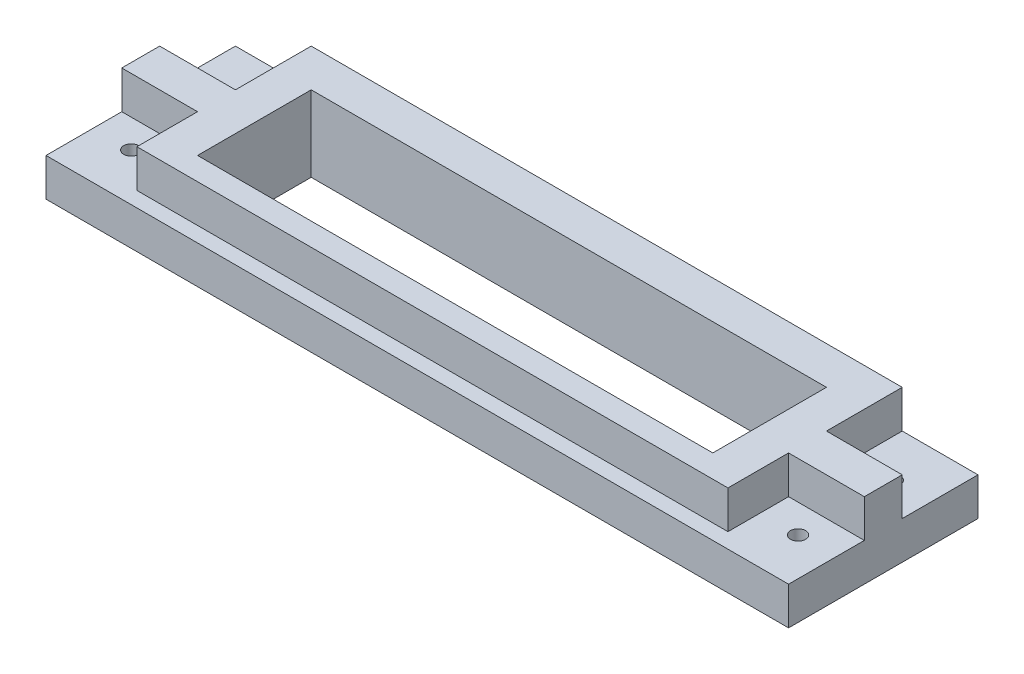
ISO-10303-21;
HEADER;
FILE_DESCRIPTION(('STEP AP214'),'2;1');
FILE_NAME('part.step','',(''),(''),'','','');
FILE_SCHEMA(('AUTOMOTIVE_DESIGN { 1 0 10303 214 1 1 1 1 }'));
ENDSEC;
DATA;
#1=APPLICATION_CONTEXT('core data for automotive mechanical design processes');
#2=APPLICATION_PROTOCOL_DEFINITION('international standard','automotive_design',2000,#1);
#3=PRODUCT_CONTEXT('',#1,'mechanical');
#4=PRODUCT('Part','Part','',(#3));
#5=PRODUCT_RELATED_PRODUCT_CATEGORY('part','',(#4));
#6=PRODUCT_DEFINITION_FORMATION('','',#4);
#7=PRODUCT_DEFINITION_CONTEXT('part definition',#1,'design');
#8=PRODUCT_DEFINITION('design','',#6,#7);
#9=PRODUCT_DEFINITION_SHAPE('','',#8);
#10=(LENGTH_UNIT() NAMED_UNIT(*) SI_UNIT(.MILLI.,.METRE.));
#11=(NAMED_UNIT(*) PLANE_ANGLE_UNIT() SI_UNIT($,.RADIAN.));
#12=(NAMED_UNIT(*) SI_UNIT($,.STERADIAN.) SOLID_ANGLE_UNIT());
#13=UNCERTAINTY_MEASURE_WITH_UNIT(LENGTH_MEASURE(1.E-05),#10,'distance_accuracy_value','');
#14=(GEOMETRIC_REPRESENTATION_CONTEXT(3) GLOBAL_UNCERTAINTY_ASSIGNED_CONTEXT((#13)) GLOBAL_UNIT_ASSIGNED_CONTEXT((#10,
#11,#12)) REPRESENTATION_CONTEXT('',''));
#15=CARTESIAN_POINT('',(0.,0.,0.));
#16=DIRECTION('',(0.,0.,1.));
#17=DIRECTION('',(1.,0.,0.));
#18=AXIS2_PLACEMENT_3D('',#15,#16,#17);
#19=CARTESIAN_POINT('',(0.,0.,0.));
#20=DIRECTION('',(0.,1.,0.));
#21=DIRECTION('',(0.,0.,1.));
#22=AXIS2_PLACEMENT_3D('',#19,#20,#21);
#23=PLANE('',#22);
#24=CARTESIAN_POINT('',(44.,0.,-6.25));
#25=DIRECTION('',(0.,-1.,0.));
#26=DIRECTION('',(0.,0.,-1.));
#27=AXIS2_PLACEMENT_3D('',#24,#25,#26);
#28=CIRCLE('',#27,1.75);
#29=CARTESIAN_POINT('',(44.,0.,-8.00000000000001));
#30=VERTEX_POINT('',#29);
#31=EDGE_CURVE('E252',#30,#30,#28,.T.);
#32=ORIENTED_EDGE('',*,*,#31,.F.);
#33=EDGE_LOOP('',(#32));
#34=FACE_BOUND('',#33,.T.);
#35=CARTESIAN_POINT('',(-44.,0.,6.25));
#36=DIRECTION('',(0.,-1.,0.));
#37=DIRECTION('',(0.,0.,-1.));
#38=AXIS2_PLACEMENT_3D('',#35,#36,#37);
#39=CIRCLE('',#38,1.75);
#40=CARTESIAN_POINT('',(-44.,0.,4.5));
#41=VERTEX_POINT('',#40);
#42=EDGE_CURVE('E271',#41,#41,#39,.T.);
#43=ORIENTED_EDGE('',*,*,#42,.F.);
#44=EDGE_LOOP('',(#43));
#45=FACE_BOUND('',#44,.T.);
#46=DIRECTION('',(-1.,0.,0.));
#47=VECTOR('',#46,1.);
#48=CARTESIAN_POINT('',(-39.,0.,-12.5));
#49=LINE('',#48,#47);
#50=CARTESIAN_POINT('',(49.,0.,-12.5));
#51=VERTEX_POINT('',#50);
#52=CARTESIAN_POINT('',(-49.,0.,-12.5));
#53=VERTEX_POINT('',#52);
#54=EDGE_CURVE('E228',#51,#53,#49,.T.);
#55=ORIENTED_EDGE('',*,*,#54,.F.);
#56=DIRECTION('',(0.,0.,-1.));
#57=VECTOR('',#56,1.);
#58=CARTESIAN_POINT('',(49.,0.,12.5));
#59=LINE('',#58,#57);
#60=CARTESIAN_POINT('',(49.,0.,12.5));
#61=VERTEX_POINT('',#60);
#62=EDGE_CURVE('E350',#61,#51,#59,.T.);
#63=ORIENTED_EDGE('',*,*,#62,.F.);
#64=DIRECTION('',(1.,0.,0.));
#65=VECTOR('',#64,1.);
#66=CARTESIAN_POINT('',(-39.,0.,12.5));
#67=LINE('',#66,#65);
#68=CARTESIAN_POINT('',(-49.,0.,12.5));
#69=VERTEX_POINT('',#68);
#70=EDGE_CURVE('E219',#69,#61,#67,.T.);
#71=ORIENTED_EDGE('',*,*,#70,.F.);
#72=DIRECTION('',(0.,0.,1.));
#73=VECTOR('',#72,1.);
#74=CARTESIAN_POINT('',(-49.,0.,12.5));
#75=LINE('',#74,#73);
#76=EDGE_CURVE('E371',#53,#69,#75,.T.);
#77=ORIENTED_EDGE('',*,*,#76,.F.);
#78=EDGE_LOOP('',(#55,#63,#71,#77));
#79=FACE_BOUND('',#78,.T.);
#80=DIRECTION('',(0.,0.,-1.));
#81=VECTOR('',#80,1.);
#82=CARTESIAN_POINT('',(-34.,0.,0.));
#83=LINE('',#82,#81);
#84=CARTESIAN_POINT('',(-34.,0.,7.50000000000001));
#85=VERTEX_POINT('',#84);
#86=CARTESIAN_POINT('',(-34.,0.,-7.50000000000001));
#87=VERTEX_POINT('',#86);
#88=EDGE_CURVE('E398',#85,#87,#83,.T.);
#89=ORIENTED_EDGE('',*,*,#88,.F.);
#90=DIRECTION('',(-1.,0.,0.));
#91=VECTOR('',#90,1.);
#92=CARTESIAN_POINT('',(0.,0.,7.50000000000001));
#93=LINE('',#92,#91);
#94=CARTESIAN_POINT('',(34.,0.,7.50000000000001));
#95=VERTEX_POINT('',#94);
#96=EDGE_CURVE('E401',#95,#85,#93,.T.);
#97=ORIENTED_EDGE('',*,*,#96,.F.);
#98=DIRECTION('',(0.,0.,-1.));
#99=VECTOR('',#98,1.);
#100=CARTESIAN_POINT('',(34.,0.,0.));
#101=LINE('',#100,#99);
#102=CARTESIAN_POINT('',(34.,0.,-7.50000000000001));
#103=VERTEX_POINT('',#102);
#104=EDGE_CURVE('E405',#95,#103,#101,.T.);
#105=ORIENTED_EDGE('',*,*,#104,.T.);
#106=DIRECTION('',(-1.,0.,0.));
#107=VECTOR('',#106,1.);
#108=CARTESIAN_POINT('',(0.,0.,-7.50000000000001));
#109=LINE('',#108,#107);
#110=EDGE_CURVE('E409',#103,#87,#109,.T.);
#111=ORIENTED_EDGE('',*,*,#110,.T.);
#112=EDGE_LOOP('',(#89,#97,#105,#111));
#113=FACE_BOUND('',#112,.T.);
#114=CARTESIAN_POINT('',(44.,0.,6.25));
#115=DIRECTION('',(0.,-1.,0.));
#116=DIRECTION('',(0.,0.,-1.));
#117=AXIS2_PLACEMENT_3D('',#114,#115,#116);
#118=CIRCLE('',#117,1.75);
#119=CARTESIAN_POINT('',(44.,0.,4.5));
#120=VERTEX_POINT('',#119);
#121=EDGE_CURVE('E263',#120,#120,#118,.F.);
#122=ORIENTED_EDGE('',*,*,#121,.T.);
#123=EDGE_LOOP('',(#122));
#124=FACE_BOUND('',#123,.T.);
#125=CARTESIAN_POINT('',(-44.,0.,-6.25));
#126=DIRECTION('',(0.,-1.,0.));
#127=DIRECTION('',(0.,0.,-1.));
#128=AXIS2_PLACEMENT_3D('',#125,#126,#127);
#129=CIRCLE('',#128,1.75);
#130=CARTESIAN_POINT('',(-44.,0.,-8.00000000000001));
#131=VERTEX_POINT('',#130);
#132=EDGE_CURVE('E272',#131,#131,#129,.F.);
#133=ORIENTED_EDGE('',*,*,#132,.T.);
#134=EDGE_LOOP('',(#133));
#135=FACE_BOUND('',#134,.T.);
#136=ADVANCED_FACE('F46',(#34,#45,#79,#113,#124,#135),#23,.F.);
#137=CARTESIAN_POINT('',(-39.,10.,-12.5));
#138=DIRECTION('',(1.,0.,0.));
#139=DIRECTION('',(0.,0.,-1.));
#140=AXIS2_PLACEMENT_3D('',#137,#138,#139);
#141=PLANE('',#140);
#142=DIRECTION('',(0.,0.,-1.));
#143=VECTOR('',#142,1.);
#144=CARTESIAN_POINT('',(-39.,5.,-12.5));
#145=LINE('',#144,#143);
#146=CARTESIAN_POINT('',(-39.,5.,10.5));
#147=VERTEX_POINT('',#146);
#148=CARTESIAN_POINT('',(-39.,5.,2.5));
#149=VERTEX_POINT('',#148);
#150=EDGE_CURVE('E376',#147,#149,#145,.T.);
#151=ORIENTED_EDGE('',*,*,#150,.F.);
#152=DIRECTION('',(0.,-1.,0.));
#153=VECTOR('',#152,1.);
#154=CARTESIAN_POINT('',(-39.,10.,10.5));
#155=LINE('',#154,#153);
#156=CARTESIAN_POINT('',(-39.,10.,10.5));
#157=VERTEX_POINT('',#156);
#158=EDGE_CURVE('E208',#157,#147,#155,.T.);
#159=ORIENTED_EDGE('',*,*,#158,.F.);
#160=DIRECTION('',(0.,0.,1.));
#161=VECTOR('',#160,1.);
#162=CARTESIAN_POINT('',(-39.,10.,-12.5));
#163=LINE('',#162,#161);
#164=CARTESIAN_POINT('',(-39.,10.,2.5));
#165=VERTEX_POINT('',#164);
#166=EDGE_CURVE('E206',#165,#157,#163,.T.);
#167=ORIENTED_EDGE('',*,*,#166,.F.);
#168=DIRECTION('',(0.,-1.,0.));
#169=VECTOR('',#168,1.);
#170=CARTESIAN_POINT('',(-39.,10.,2.5));
#171=LINE('',#170,#169);
#172=EDGE_CURVE('E314',#165,#149,#171,.T.);
#173=ORIENTED_EDGE('',*,*,#172,.T.);
#174=EDGE_LOOP('',(#151,#159,#167,#173));
#175=FACE_BOUND('',#174,.T.);
#176=ADVANCED_FACE('F468',(#175),#141,.F.);
#177=CARTESIAN_POINT('',(39.,10.,-12.5));
#178=DIRECTION('',(-1.,0.,0.));
#179=DIRECTION('',(0.,0.,1.));
#180=AXIS2_PLACEMENT_3D('',#177,#178,#179);
#181=PLANE('',#180);
#182=DIRECTION('',(0.,-1.,0.));
#183=VECTOR('',#182,1.);
#184=CARTESIAN_POINT('',(39.,10.,-2.50000000000003));
#185=LINE('',#184,#183);
#186=CARTESIAN_POINT('',(39.,10.,-2.50000000000003));
#187=VERTEX_POINT('',#186);
#188=CARTESIAN_POINT('',(39.,5.,-2.50000000000003));
#189=VERTEX_POINT('',#188);
#190=EDGE_CURVE('E338',#187,#189,#185,.T.);
#191=ORIENTED_EDGE('',*,*,#190,.T.);
#192=DIRECTION('',(0.,0.,1.));
#193=VECTOR('',#192,1.);
#194=CARTESIAN_POINT('',(39.,5.,12.5));
#195=LINE('',#194,#193);
#196=CARTESIAN_POINT('',(39.,5.,-12.5));
#197=VERTEX_POINT('',#196);
#198=EDGE_CURVE('E351',#197,#189,#195,.T.);
#199=ORIENTED_EDGE('',*,*,#198,.F.);
#200=DIRECTION('',(0.,-1.,0.));
#201=VECTOR('',#200,1.);
#202=CARTESIAN_POINT('',(39.,10.,-12.5));
#203=LINE('',#202,#201);
#204=CARTESIAN_POINT('',(39.,10.,-12.5));
#205=VERTEX_POINT('',#204);
#206=EDGE_CURVE('E11',#205,#197,#203,.T.);
#207=ORIENTED_EDGE('',*,*,#206,.F.);
#208=DIRECTION('',(0.,0.,-1.));
#209=VECTOR('',#208,1.);
#210=CARTESIAN_POINT('',(39.,10.,-12.5));
#211=LINE('',#210,#209);
#212=EDGE_CURVE('E214',#187,#205,#211,.T.);
#213=ORIENTED_EDGE('',*,*,#212,.F.);
#214=EDGE_LOOP('',(#191,#199,#207,#213));
#215=FACE_BOUND('',#214,.T.);
#216=ADVANCED_FACE('F474',(#215),#181,.F.);
#217=CARTESIAN_POINT('',(49.,5.,12.5));
#218=DIRECTION('',(0.,-1.,0.));
#219=DIRECTION('',(0.,0.,-1.));
#220=AXIS2_PLACEMENT_3D('',#217,#218,#219);
#221=PLANE('',#220);
#222=CARTESIAN_POINT('',(44.,5.,-6.24999999999999));
#223=DIRECTION('',(0.,-1.,0.));
#224=DIRECTION('',(0.,0.,-1.));
#225=AXIS2_PLACEMENT_3D('',#222,#223,#224);
#226=CIRCLE('',#225,0.999999999999998);
#227=CARTESIAN_POINT('',(44.,5.,-7.24999999999999));
#228=VERTEX_POINT('',#227);
#229=EDGE_CURVE('E245',#228,#228,#226,.T.);
#230=ORIENTED_EDGE('',*,*,#229,.T.);
#231=EDGE_LOOP('',(#230));
#232=FACE_BOUND('',#231,.T.);
#233=DIRECTION('',(-1.,0.,0.));
#234=VECTOR('',#233,1.);
#235=CARTESIAN_POINT('',(0.,5.,-2.49999999999994));
#236=LINE('',#235,#234);
#237=CARTESIAN_POINT('',(49.,5.,-2.50000000000005));
#238=VERTEX_POINT('',#237);
#239=EDGE_CURVE('E318',#238,#189,#236,.T.);
#240=ORIENTED_EDGE('',*,*,#239,.F.);
#241=DIRECTION('',(0.,0.,1.));
#242=VECTOR('',#241,1.);
#243=CARTESIAN_POINT('',(49.,5.,12.5));
#244=LINE('',#243,#242);
#245=CARTESIAN_POINT('',(49.,5.,-12.5));
#246=VERTEX_POINT('',#245);
#247=EDGE_CURVE('E359',#246,#238,#244,.T.);
#248=ORIENTED_EDGE('',*,*,#247,.F.);
#249=DIRECTION('',(-1.,0.,0.));
#250=VECTOR('',#249,1.);
#251=CARTESIAN_POINT('',(49.,5.,-12.5));
#252=LINE('',#251,#250);
#253=EDGE_CURVE('E363',#246,#197,#252,.T.);
#254=ORIENTED_EDGE('',*,*,#253,.T.);
#255=ORIENTED_EDGE('',*,*,#198,.T.);
#256=EDGE_LOOP('',(#240,#248,#254,#255));
#257=FACE_BOUND('',#256,.T.);
#258=ADVANCED_FACE('F571',(#232,#257),#221,.F.);
#259=CARTESIAN_POINT('',(39.,10.,10.5));
#260=VERTEX_POINT('',#259);
#261=CARTESIAN_POINT('',(39.,10.,2.5));
#262=VERTEX_POINT('',#261);
#263=EDGE_CURVE('E203',#260,#262,#211,.T.);
#264=ORIENTED_EDGE('',*,*,#263,.F.);
#265=DIRECTION('',(0.,1.,0.));
#266=VECTOR('',#265,1.);
#267=CARTESIAN_POINT('',(39.,10.,10.5));
#268=LINE('',#267,#266);
#269=CARTESIAN_POINT('',(39.,5.,10.5));
#270=VERTEX_POINT('',#269);
#271=EDGE_CURVE('E185',#270,#260,#268,.T.);
#272=ORIENTED_EDGE('',*,*,#271,.F.);
#273=CARTESIAN_POINT('',(39.,5.,2.5));
#274=VERTEX_POINT('',#273);
#275=EDGE_CURVE('E345',#274,#270,#195,.T.);
#276=ORIENTED_EDGE('',*,*,#275,.F.);
#277=DIRECTION('',(0.,-1.,0.));
#278=VECTOR('',#277,1.);
#279=CARTESIAN_POINT('',(39.,10.,2.5));
#280=LINE('',#279,#278);
#281=EDGE_CURVE('E211',#262,#274,#280,.T.);
#282=ORIENTED_EDGE('',*,*,#281,.F.);
#283=EDGE_LOOP('',(#264,#272,#276,#282));
#284=FACE_BOUND('',#283,.T.);
#285=ADVANCED_FACE('F48',(#284),#181,.F.);
#286=CARTESIAN_POINT('',(-39.,5.,-2.50000000000003));
#287=VERTEX_POINT('',#286);
#288=CARTESIAN_POINT('',(-39.,5.,-12.5));
#289=VERTEX_POINT('',#288);
#290=EDGE_CURVE('E370',#287,#289,#145,.T.);
#291=ORIENTED_EDGE('',*,*,#290,.F.);
#292=DIRECTION('',(0.,-1.,0.));
#293=VECTOR('',#292,1.);
#294=CARTESIAN_POINT('',(-39.,10.,-2.50000000000003));
#295=LINE('',#294,#293);
#296=CARTESIAN_POINT('',(-39.,10.,-2.50000000000003));
#297=VERTEX_POINT('',#296);
#298=EDGE_CURVE('E311',#297,#287,#295,.T.);
#299=ORIENTED_EDGE('',*,*,#298,.F.);
#300=CARTESIAN_POINT('',(-39.,10.,-12.5));
#301=VERTEX_POINT('',#300);
#302=EDGE_CURVE('E224',#301,#297,#163,.T.);
#303=ORIENTED_EDGE('',*,*,#302,.F.);
#304=DIRECTION('',(0.,-1.,0.));
#305=VECTOR('',#304,1.);
#306=CARTESIAN_POINT('',(-39.,10.,-12.5));
#307=LINE('',#306,#305);
#308=EDGE_CURVE('E56',#301,#289,#307,.T.);
#309=ORIENTED_EDGE('',*,*,#308,.T.);
#310=EDGE_LOOP('',(#291,#299,#303,#309));
#311=FACE_BOUND('',#310,.T.);
#312=ADVANCED_FACE('F477',(#311),#141,.F.);
#313=CARTESIAN_POINT('',(0.,10.,0.));
#314=DIRECTION('',(0.,1.,0.));
#315=DIRECTION('',(0.,0.,1.));
#316=AXIS2_PLACEMENT_3D('',#313,#314,#315);
#317=PLANE('',#316);
#318=DIRECTION('',(-1.,0.,0.));
#319=VECTOR('',#318,1.);
#320=CARTESIAN_POINT('',(39.,10.,10.5));
#321=LINE('',#320,#319);
#322=EDGE_CURVE('E188',#260,#157,#321,.T.);
#323=ORIENTED_EDGE('',*,*,#322,.F.);
#324=ORIENTED_EDGE('',*,*,#263,.T.);
#325=DIRECTION('',(-1.,0.,0.));
#326=VECTOR('',#325,1.);
#327=CARTESIAN_POINT('',(0.,10.,2.49999999999999));
#328=LINE('',#327,#326);
#329=CARTESIAN_POINT('',(49.,10.,2.5));
#330=VERTEX_POINT('',#329);
#331=EDGE_CURVE('E326',#330,#262,#328,.T.);
#332=ORIENTED_EDGE('',*,*,#331,.F.);
#333=DIRECTION('',(0.,0.,1.));
#334=VECTOR('',#333,1.);
#335=CARTESIAN_POINT('',(49.,10.,0.));
#336=LINE('',#335,#334);
#337=CARTESIAN_POINT('',(49.,10.,-2.50000000000005));
#338=VERTEX_POINT('',#337);
#339=EDGE_CURVE('E319',#338,#330,#336,.T.);
#340=ORIENTED_EDGE('',*,*,#339,.F.);
#341=DIRECTION('',(-1.,0.,0.));
#342=VECTOR('',#341,1.);
#343=CARTESIAN_POINT('',(0.,10.,-2.49999999999994));
#344=LINE('',#343,#342);
#345=EDGE_CURVE('E323',#338,#187,#344,.T.);
#346=ORIENTED_EDGE('',*,*,#345,.T.);
#347=ORIENTED_EDGE('',*,*,#212,.T.);
#348=DIRECTION('',(-1.,0.,0.));
#349=VECTOR('',#348,1.);
#350=CARTESIAN_POINT('',(-39.,10.,-12.5));
#351=LINE('',#350,#349);
#352=EDGE_CURVE('E213',#205,#301,#351,.T.);
#353=ORIENTED_EDGE('',*,*,#352,.T.);
#354=ORIENTED_EDGE('',*,*,#302,.T.);
#355=DIRECTION('',(1.,0.,0.));
#356=VECTOR('',#355,1.);
#357=CARTESIAN_POINT('',(0.,10.,-2.49999999999994));
#358=LINE('',#357,#356);
#359=CARTESIAN_POINT('',(-49.,10.,-2.50000000000005));
#360=VERTEX_POINT('',#359);
#361=EDGE_CURVE('E294',#360,#297,#358,.T.);
#362=ORIENTED_EDGE('',*,*,#361,.F.);
#363=DIRECTION('',(0.,0.,1.));
#364=VECTOR('',#363,1.);
#365=CARTESIAN_POINT('',(-49.,10.,0.));
#366=LINE('',#365,#364);
#367=CARTESIAN_POINT('',(-49.,10.,2.5));
#368=VERTEX_POINT('',#367);
#369=EDGE_CURVE('E297',#360,#368,#366,.T.);
#370=ORIENTED_EDGE('',*,*,#369,.T.);
#371=DIRECTION('',(1.,0.,0.));
#372=VECTOR('',#371,1.);
#373=CARTESIAN_POINT('',(0.,10.,2.49999999999999));
#374=LINE('',#373,#372);
#375=EDGE_CURVE('E291',#368,#165,#374,.T.);
#376=ORIENTED_EDGE('',*,*,#375,.T.);
#377=ORIENTED_EDGE('',*,*,#166,.T.);
#378=EDGE_LOOP('',(#323,#324,#332,#340,#346,#347,#353,#354,#362,#370,#376,#377));
#379=FACE_BOUND('',#378,.T.);
#380=DIRECTION('',(-1.,0.,0.));
#381=VECTOR('',#380,1.);
#382=CARTESIAN_POINT('',(0.,10.,7.50000000000001));
#383=LINE('',#382,#381);
#384=CARTESIAN_POINT('',(34.,10.,7.50000000000001));
#385=VERTEX_POINT('',#384);
#386=CARTESIAN_POINT('',(-34.,10.,7.50000000000001));
#387=VERTEX_POINT('',#386);
#388=EDGE_CURVE('E416',#385,#387,#383,.T.);
#389=ORIENTED_EDGE('',*,*,#388,.T.);
#390=DIRECTION('',(0.,0.,-1.));
#391=VECTOR('',#390,1.);
#392=CARTESIAN_POINT('',(-34.,10.,0.));
#393=LINE('',#392,#391);
#394=CARTESIAN_POINT('',(-34.,10.,-7.50000000000001));
#395=VERTEX_POINT('',#394);
#396=EDGE_CURVE('E397',#387,#395,#393,.T.);
#397=ORIENTED_EDGE('',*,*,#396,.T.);
#398=DIRECTION('',(-1.,0.,0.));
#399=VECTOR('',#398,1.);
#400=CARTESIAN_POINT('',(0.,10.,-7.50000000000001));
#401=LINE('',#400,#399);
#402=CARTESIAN_POINT('',(34.,10.,-7.50000000000001));
#403=VERTEX_POINT('',#402);
#404=EDGE_CURVE('E402',#403,#395,#401,.T.);
#405=ORIENTED_EDGE('',*,*,#404,.F.);
#406=DIRECTION('',(0.,0.,-1.));
#407=VECTOR('',#406,1.);
#408=CARTESIAN_POINT('',(34.,10.,0.));
#409=LINE('',#408,#407);
#410=EDGE_CURVE('E420',#385,#403,#409,.T.);
#411=ORIENTED_EDGE('',*,*,#410,.F.);
#412=EDGE_LOOP('',(#389,#397,#405,#411));
#413=FACE_BOUND('',#412,.T.);
#414=ADVANCED_FACE('F200',(#379,#413),#317,.T.);
#415=CARTESIAN_POINT('',(-39.,10.,-12.5));
#416=DIRECTION('',(0.,0.,1.));
#417=DIRECTION('',(1.,0.,0.));
#418=AXIS2_PLACEMENT_3D('',#415,#416,#417);
#419=PLANE('',#418);
#420=ORIENTED_EDGE('',*,*,#54,.T.);
#421=DIRECTION('',(0.,-1.,0.));
#422=VECTOR('',#421,1.);
#423=CARTESIAN_POINT('',(-49.,0.,-12.5));
#424=LINE('',#423,#422);
#425=CARTESIAN_POINT('',(-49.,5.,-12.5));
#426=VERTEX_POINT('',#425);
#427=EDGE_CURVE('E384',#426,#53,#424,.T.);
#428=ORIENTED_EDGE('',*,*,#427,.F.);
#429=DIRECTION('',(1.,0.,0.));
#430=VECTOR('',#429,1.);
#431=CARTESIAN_POINT('',(-49.,5.,-12.5));
#432=LINE('',#431,#430);
#433=EDGE_CURVE('E388',#426,#289,#432,.T.);
#434=ORIENTED_EDGE('',*,*,#433,.T.);
#435=ORIENTED_EDGE('',*,*,#308,.F.);
#436=ORIENTED_EDGE('',*,*,#352,.F.);
#437=ORIENTED_EDGE('',*,*,#206,.T.);
#438=ORIENTED_EDGE('',*,*,#253,.F.);
#439=DIRECTION('',(0.,1.,0.));
#440=VECTOR('',#439,1.);
#441=CARTESIAN_POINT('',(49.,5.,-12.5));
#442=LINE('',#441,#440);
#443=EDGE_CURVE('E355',#51,#246,#442,.T.);
#444=ORIENTED_EDGE('',*,*,#443,.F.);
#445=EDGE_LOOP('',(#420,#428,#434,#435,#436,#437,#438,#444));
#446=FACE_BOUND('',#445,.T.);
#447=ADVANCED_FACE('F462',(#446),#419,.F.);
#448=CARTESIAN_POINT('',(-39.,10.,12.5));
#449=DIRECTION('',(0.,0.,-1.));
#450=DIRECTION('',(-1.,0.,0.));
#451=AXIS2_PLACEMENT_3D('',#448,#449,#450);
#452=PLANE('',#451);
#453=DIRECTION('',(0.,-1.,0.));
#454=VECTOR('',#453,1.);
#455=CARTESIAN_POINT('',(49.,5.,12.5));
#456=LINE('',#455,#454);
#457=CARTESIAN_POINT('',(49.,5.,12.5));
#458=VERTEX_POINT('',#457);
#459=EDGE_CURVE('E346',#458,#61,#456,.T.);
#460=ORIENTED_EDGE('',*,*,#459,.F.);
#461=DIRECTION('',(1.,0.,0.));
#462=VECTOR('',#461,1.);
#463=CARTESIAN_POINT('',(-49.,5.,12.5));
#464=LINE('',#463,#462);
#465=CARTESIAN_POINT('',(-49.,5.,12.5));
#466=VERTEX_POINT('',#465);
#467=EDGE_CURVE('E394',#466,#458,#464,.T.);
#468=ORIENTED_EDGE('',*,*,#467,.F.);
#469=DIRECTION('',(0.,1.,0.));
#470=VECTOR('',#469,1.);
#471=CARTESIAN_POINT('',(-49.,5.,12.5));
#472=LINE('',#471,#470);
#473=EDGE_CURVE('E375',#69,#466,#472,.T.);
#474=ORIENTED_EDGE('',*,*,#473,.F.);
#475=ORIENTED_EDGE('',*,*,#70,.T.);
#476=EDGE_LOOP('',(#460,#468,#474,#475));
#477=FACE_BOUND('',#476,.T.);
#478=ADVANCED_FACE('F455',(#477),#452,.F.);
#479=CARTESIAN_POINT('',(-34.,0.,0.));
#480=DIRECTION('',(1.,0.,0.));
#481=DIRECTION('',(0.,0.,-1.));
#482=AXIS2_PLACEMENT_3D('',#479,#480,#481);
#483=PLANE('',#482);
#484=ORIENTED_EDGE('',*,*,#396,.F.);
#485=DIRECTION('',(0.,1.,0.));
#486=VECTOR('',#485,1.);
#487=CARTESIAN_POINT('',(-34.,0.,7.50000000000001));
#488=LINE('',#487,#486);
#489=EDGE_CURVE('E221',#85,#387,#488,.T.);
#490=ORIENTED_EDGE('',*,*,#489,.F.);
#491=ORIENTED_EDGE('',*,*,#88,.T.);
#492=DIRECTION('',(0.,1.,0.));
#493=VECTOR('',#492,1.);
#494=CARTESIAN_POINT('',(-34.,0.,-7.50000000000001));
#495=LINE('',#494,#493);
#496=EDGE_CURVE('E231',#87,#395,#495,.T.);
#497=ORIENTED_EDGE('',*,*,#496,.T.);
#498=EDGE_LOOP('',(#484,#490,#491,#497));
#499=FACE_BOUND('',#498,.T.);
#500=ADVANCED_FACE('F453',(#499),#483,.T.);
#501=CARTESIAN_POINT('',(0.,0.,-7.50000000000001));
#502=DIRECTION('',(0.,0.,-1.));
#503=DIRECTION('',(-1.,0.,0.));
#504=AXIS2_PLACEMENT_3D('',#501,#502,#503);
#505=PLANE('',#504);
#506=ORIENTED_EDGE('',*,*,#404,.T.);
#507=ORIENTED_EDGE('',*,*,#496,.F.);
#508=ORIENTED_EDGE('',*,*,#110,.F.);
#509=DIRECTION('',(0.,1.,0.));
#510=VECTOR('',#509,1.);
#511=CARTESIAN_POINT('',(34.,0.,-7.50000000000001));
#512=LINE('',#511,#510);
#513=EDGE_CURVE('E429',#103,#403,#512,.T.);
#514=ORIENTED_EDGE('',*,*,#513,.T.);
#515=EDGE_LOOP('',(#506,#507,#508,#514));
#516=FACE_BOUND('',#515,.T.);
#517=ADVANCED_FACE('F450',(#516),#505,.F.);
#518=CARTESIAN_POINT('',(34.,0.,0.));
#519=DIRECTION('',(1.,0.,0.));
#520=DIRECTION('',(0.,0.,-1.));
#521=AXIS2_PLACEMENT_3D('',#518,#519,#520);
#522=PLANE('',#521);
#523=ORIENTED_EDGE('',*,*,#410,.T.);
#524=ORIENTED_EDGE('',*,*,#513,.F.);
#525=ORIENTED_EDGE('',*,*,#104,.F.);
#526=DIRECTION('',(0.,1.,0.));
#527=VECTOR('',#526,1.);
#528=CARTESIAN_POINT('',(34.,0.,7.50000000000001));
#529=LINE('',#528,#527);
#530=EDGE_CURVE('E431',#95,#385,#529,.T.);
#531=ORIENTED_EDGE('',*,*,#530,.T.);
#532=EDGE_LOOP('',(#523,#524,#525,#531));
#533=FACE_BOUND('',#532,.T.);
#534=ADVANCED_FACE('F446',(#533),#522,.F.);
#535=CARTESIAN_POINT('',(0.,0.,7.50000000000001));
#536=DIRECTION('',(0.,0.,-1.));
#537=DIRECTION('',(-1.,0.,0.));
#538=AXIS2_PLACEMENT_3D('',#535,#536,#537);
#539=PLANE('',#538);
#540=ORIENTED_EDGE('',*,*,#388,.F.);
#541=ORIENTED_EDGE('',*,*,#530,.F.);
#542=ORIENTED_EDGE('',*,*,#96,.T.);
#543=ORIENTED_EDGE('',*,*,#489,.T.);
#544=EDGE_LOOP('',(#540,#541,#542,#543));
#545=FACE_BOUND('',#544,.T.);
#546=ADVANCED_FACE('F440',(#545),#539,.T.);
#547=CARTESIAN_POINT('',(-49.,5.,-12.5));
#548=DIRECTION('',(0.,-1.,0.));
#549=DIRECTION('',(0.,0.,-1.));
#550=AXIS2_PLACEMENT_3D('',#547,#548,#549);
#551=PLANE('',#550);
#552=CARTESIAN_POINT('',(-44.,5.,-6.24999999999999));
#553=DIRECTION('',(0.,-1.,0.));
#554=DIRECTION('',(0.,0.,-1.));
#555=AXIS2_PLACEMENT_3D('',#552,#553,#554);
#556=CIRCLE('',#555,0.999999999999998);
#557=CARTESIAN_POINT('',(-44.,5.,-7.24999999999999));
#558=VERTEX_POINT('',#557);
#559=EDGE_CURVE('E241',#558,#558,#556,.F.);
#560=ORIENTED_EDGE('',*,*,#559,.F.);
#561=EDGE_LOOP('',(#560));
#562=FACE_BOUND('',#561,.T.);
#563=DIRECTION('',(0.,0.,-1.));
#564=VECTOR('',#563,1.);
#565=CARTESIAN_POINT('',(-49.,5.,-12.5));
#566=LINE('',#565,#564);
#567=CARTESIAN_POINT('',(-49.,5.,-2.50000000000005));
#568=VERTEX_POINT('',#567);
#569=EDGE_CURVE('E379',#568,#426,#566,.T.);
#570=ORIENTED_EDGE('',*,*,#569,.F.);
#571=DIRECTION('',(1.,0.,0.));
#572=VECTOR('',#571,1.);
#573=CARTESIAN_POINT('',(0.,5.,-2.49999999999994));
#574=LINE('',#573,#572);
#575=EDGE_CURVE('E64',#568,#287,#574,.T.);
#576=ORIENTED_EDGE('',*,*,#575,.T.);
#577=ORIENTED_EDGE('',*,*,#290,.T.);
#578=ORIENTED_EDGE('',*,*,#433,.F.);
#579=EDGE_LOOP('',(#570,#576,#577,#578));
#580=FACE_BOUND('',#579,.T.);
#581=ADVANCED_FACE('F574',(#562,#580),#551,.F.);
#582=CARTESIAN_POINT('',(-49.,0.,0.));
#583=DIRECTION('',(1.,0.,0.));
#584=DIRECTION('',(0.,0.,-1.));
#585=AXIS2_PLACEMENT_3D('',#582,#583,#584);
#586=PLANE('',#585);
#587=ORIENTED_EDGE('',*,*,#76,.T.);
#588=ORIENTED_EDGE('',*,*,#473,.T.);
#589=CARTESIAN_POINT('',(-49.,5.,2.5));
#590=VERTEX_POINT('',#589);
#591=EDGE_CURVE('E380',#466,#590,#566,.T.);
#592=ORIENTED_EDGE('',*,*,#591,.T.);
#593=DIRECTION('',(0.,-1.,0.));
#594=VECTOR('',#593,1.);
#595=CARTESIAN_POINT('',(-49.,10.,2.5));
#596=LINE('',#595,#594);
#597=EDGE_CURVE('E300',#368,#590,#596,.T.);
#598=ORIENTED_EDGE('',*,*,#597,.F.);
#599=ORIENTED_EDGE('',*,*,#369,.F.);
#600=DIRECTION('',(0.,-1.,0.));
#601=VECTOR('',#600,1.);
#602=CARTESIAN_POINT('',(-49.,10.,-2.50000000000005));
#603=LINE('',#602,#601);
#604=EDGE_CURVE('E308',#360,#568,#603,.T.);
#605=ORIENTED_EDGE('',*,*,#604,.T.);
#606=ORIENTED_EDGE('',*,*,#569,.T.);
#607=ORIENTED_EDGE('',*,*,#427,.T.);
#608=EDGE_LOOP('',(#587,#588,#592,#598,#599,#605,#606,#607));
#609=FACE_BOUND('',#608,.T.);
#610=ADVANCED_FACE('F493',(#609),#586,.F.);
#611=CARTESIAN_POINT('',(44.,5.,6.25));
#612=DIRECTION('',(0.,-1.,0.));
#613=DIRECTION('',(0.,0.,-1.));
#614=AXIS2_PLACEMENT_3D('',#611,#612,#613);
#615=CIRCLE('',#614,0.999999999999998);
#616=CARTESIAN_POINT('',(44.,5.,5.25));
#617=VERTEX_POINT('',#616);
#618=EDGE_CURVE('E237',#617,#617,#615,.F.);
#619=ORIENTED_EDGE('',*,*,#618,.F.);
#620=EDGE_LOOP('',(#619));
#621=FACE_BOUND('',#620,.T.);
#622=CARTESIAN_POINT('',(49.,5.,2.5));
#623=VERTEX_POINT('',#622);
#624=EDGE_CURVE('E358',#623,#458,#244,.T.);
#625=ORIENTED_EDGE('',*,*,#624,.F.);
#626=DIRECTION('',(-1.,0.,0.));
#627=VECTOR('',#626,1.);
#628=CARTESIAN_POINT('',(0.,5.,2.49999999999999));
#629=LINE('',#628,#627);
#630=EDGE_CURVE('E72',#623,#274,#629,.T.);
#631=ORIENTED_EDGE('',*,*,#630,.T.);
#632=ORIENTED_EDGE('',*,*,#275,.T.);
#633=DIRECTION('',(1.,0.,0.));
#634=VECTOR('',#633,1.);
#635=CARTESIAN_POINT('',(39.,5.,10.5));
#636=LINE('',#635,#634);
#637=EDGE_CURVE('E191',#147,#270,#636,.T.);
#638=ORIENTED_EDGE('',*,*,#637,.F.);
#639=ORIENTED_EDGE('',*,*,#150,.T.);
#640=DIRECTION('',(1.,0.,0.));
#641=VECTOR('',#640,1.);
#642=CARTESIAN_POINT('',(0.,5.,2.49999999999999));
#643=LINE('',#642,#641);
#644=EDGE_CURVE('E287',#590,#149,#643,.T.);
#645=ORIENTED_EDGE('',*,*,#644,.F.);
#646=ORIENTED_EDGE('',*,*,#591,.F.);
#647=ORIENTED_EDGE('',*,*,#467,.T.);
#648=EDGE_LOOP('',(#625,#631,#632,#638,#639,#645,#646,#647));
#649=FACE_BOUND('',#648,.T.);
#650=CARTESIAN_POINT('',(-44.,5.,6.25));
#651=DIRECTION('',(0.,-1.,0.));
#652=DIRECTION('',(0.,0.,-1.));
#653=AXIS2_PLACEMENT_3D('',#650,#651,#652);
#654=CIRCLE('',#653,0.999999999999998);
#655=CARTESIAN_POINT('',(-44.,5.,5.25));
#656=VERTEX_POINT('',#655);
#657=EDGE_CURVE('E50',#656,#656,#654,.T.);
#658=ORIENTED_EDGE('',*,*,#657,.T.);
#659=EDGE_LOOP('',(#658));
#660=FACE_BOUND('',#659,.T.);
#661=ADVANCED_FACE('F506',(#621,#649,#660),#221,.F.);
#662=CARTESIAN_POINT('',(49.,0.,0.));
#663=DIRECTION('',(1.,0.,0.));
#664=DIRECTION('',(0.,0.,-1.));
#665=AXIS2_PLACEMENT_3D('',#662,#663,#664);
#666=PLANE('',#665);
#667=ORIENTED_EDGE('',*,*,#459,.T.);
#668=ORIENTED_EDGE('',*,*,#62,.T.);
#669=ORIENTED_EDGE('',*,*,#443,.T.);
#670=ORIENTED_EDGE('',*,*,#247,.T.);
#671=DIRECTION('',(0.,-1.,0.));
#672=VECTOR('',#671,1.);
#673=CARTESIAN_POINT('',(49.,10.,-2.50000000000005));
#674=LINE('',#673,#672);
#675=EDGE_CURVE('E342',#338,#238,#674,.T.);
#676=ORIENTED_EDGE('',*,*,#675,.F.);
#677=ORIENTED_EDGE('',*,*,#339,.T.);
#678=DIRECTION('',(0.,-1.,0.));
#679=VECTOR('',#678,1.);
#680=CARTESIAN_POINT('',(49.,10.,2.5));
#681=LINE('',#680,#679);
#682=EDGE_CURVE('E329',#330,#623,#681,.T.);
#683=ORIENTED_EDGE('',*,*,#682,.T.);
#684=ORIENTED_EDGE('',*,*,#624,.T.);
#685=EDGE_LOOP('',(#667,#668,#669,#670,#676,#677,#683,#684));
#686=FACE_BOUND('',#685,.T.);
#687=ADVANCED_FACE('F563',(#686),#666,.T.);
#688=CARTESIAN_POINT('',(0.,10.,-2.49999999999994));
#689=DIRECTION('',(0.,0.,1.));
#690=DIRECTION('',(1.,0.,0.));
#691=AXIS2_PLACEMENT_3D('',#688,#689,#690);
#692=PLANE('',#691);
#693=ORIENTED_EDGE('',*,*,#239,.T.);
#694=ORIENTED_EDGE('',*,*,#190,.F.);
#695=ORIENTED_EDGE('',*,*,#345,.F.);
#696=ORIENTED_EDGE('',*,*,#675,.T.);
#697=EDGE_LOOP('',(#693,#694,#695,#696));
#698=FACE_BOUND('',#697,.T.);
#699=ADVANCED_FACE('F560',(#698),#692,.F.);
#700=CARTESIAN_POINT('',(0.,10.,2.49999999999999));
#701=DIRECTION('',(0.,0.,1.));
#702=DIRECTION('',(1.,0.,0.));
#703=AXIS2_PLACEMENT_3D('',#700,#701,#702);
#704=PLANE('',#703);
#705=ORIENTED_EDGE('',*,*,#630,.F.);
#706=ORIENTED_EDGE('',*,*,#682,.F.);
#707=ORIENTED_EDGE('',*,*,#331,.T.);
#708=ORIENTED_EDGE('',*,*,#281,.T.);
#709=EDGE_LOOP('',(#705,#706,#707,#708));
#710=FACE_BOUND('',#709,.T.);
#711=ADVANCED_FACE('F557',(#710),#704,.T.);
#712=CARTESIAN_POINT('',(0.,10.,2.49999999999999));
#713=DIRECTION('',(0.,0.,-1.));
#714=DIRECTION('',(-1.,0.,0.));
#715=AXIS2_PLACEMENT_3D('',#712,#713,#714);
#716=PLANE('',#715);
#717=ORIENTED_EDGE('',*,*,#644,.T.);
#718=ORIENTED_EDGE('',*,*,#172,.F.);
#719=ORIENTED_EDGE('',*,*,#375,.F.);
#720=ORIENTED_EDGE('',*,*,#597,.T.);
#721=EDGE_LOOP('',(#717,#718,#719,#720));
#722=FACE_BOUND('',#721,.T.);
#723=ADVANCED_FACE('F511',(#722),#716,.F.);
#724=CARTESIAN_POINT('',(0.,10.,-2.49999999999994));
#725=DIRECTION('',(0.,0.,-1.));
#726=DIRECTION('',(-1.,0.,0.));
#727=AXIS2_PLACEMENT_3D('',#724,#725,#726);
#728=PLANE('',#727);
#729=ORIENTED_EDGE('',*,*,#575,.F.);
#730=ORIENTED_EDGE('',*,*,#604,.F.);
#731=ORIENTED_EDGE('',*,*,#361,.T.);
#732=ORIENTED_EDGE('',*,*,#298,.T.);
#733=EDGE_LOOP('',(#729,#730,#731,#732));
#734=FACE_BOUND('',#733,.T.);
#735=ADVANCED_FACE('F546',(#734),#728,.T.);
#736=CARTESIAN_POINT('',(-44.,2.,6.25));
#737=DIRECTION('',(0.,-1.,0.));
#738=DIRECTION('',(0.,0.,-1.));
#739=AXIS2_PLACEMENT_3D('',#736,#737,#738);
#740=CYLINDRICAL_SURFACE('',#739,1.75);
#741=CARTESIAN_POINT('',(-44.,2.,6.25));
#742=DIRECTION('',(0.,-1.,0.));
#743=DIRECTION('',(0.,0.,-1.));
#744=AXIS2_PLACEMENT_3D('',#741,#742,#743);
#745=CIRCLE('',#744,1.75);
#746=CARTESIAN_POINT('',(-44.,2.,4.5));
#747=VERTEX_POINT('',#746);
#748=EDGE_CURVE('E283',#747,#747,#745,.T.);
#749=ORIENTED_EDGE('',*,*,#748,.F.);
#750=EDGE_LOOP('',(#749));
#751=FACE_BOUND('',#750,.T.);
#752=ORIENTED_EDGE('',*,*,#42,.T.);
#753=EDGE_LOOP('',(#752));
#754=FACE_BOUND('',#753,.T.);
#755=ADVANCED_FACE('F540',(#751,#754),#740,.F.);
#756=CARTESIAN_POINT('',(0.,2.,0.));
#757=DIRECTION('',(0.,-1.,0.));
#758=DIRECTION('',(0.,0.,-1.));
#759=AXIS2_PLACEMENT_3D('',#756,#757,#758);
#760=PLANE('',#759);
#761=CARTESIAN_POINT('',(-44.,2.,6.25));
#762=DIRECTION('',(0.,-1.,0.));
#763=DIRECTION('',(0.,0.,-1.));
#764=AXIS2_PLACEMENT_3D('',#761,#762,#763);
#765=CIRCLE('',#764,0.999999999999998);
#766=CARTESIAN_POINT('',(-44.,2.,5.25));
#767=VERTEX_POINT('',#766);
#768=EDGE_CURVE('E242',#767,#767,#765,.T.);
#769=ORIENTED_EDGE('',*,*,#768,.F.);
#770=EDGE_LOOP('',(#769));
#771=FACE_BOUND('',#770,.T.);
#772=ORIENTED_EDGE('',*,*,#748,.T.);
#773=EDGE_LOOP('',(#772));
#774=FACE_BOUND('',#773,.T.);
#775=ADVANCED_FACE('F536',(#771,#774),#760,.T.);
#776=CARTESIAN_POINT('',(44.,2.,-6.25));
#777=DIRECTION('',(0.,-1.,0.));
#778=DIRECTION('',(0.,0.,-1.));
#779=AXIS2_PLACEMENT_3D('',#776,#777,#778);
#780=CYLINDRICAL_SURFACE('',#779,1.75);
#781=CARTESIAN_POINT('',(44.,2.,-6.25));
#782=DIRECTION('',(0.,-1.,0.));
#783=DIRECTION('',(0.,0.,-1.));
#784=AXIS2_PLACEMENT_3D('',#781,#782,#783);
#785=CIRCLE('',#784,1.75);
#786=CARTESIAN_POINT('',(44.,2.,-8.00000000000001));
#787=VERTEX_POINT('',#786);
#788=EDGE_CURVE('E257',#787,#787,#785,.T.);
#789=ORIENTED_EDGE('',*,*,#788,.F.);
#790=EDGE_LOOP('',(#789));
#791=FACE_BOUND('',#790,.T.);
#792=ORIENTED_EDGE('',*,*,#31,.T.);
#793=EDGE_LOOP('',(#792));
#794=FACE_BOUND('',#793,.T.);
#795=ADVANCED_FACE('F539',(#791,#794),#780,.F.);
#796=CARTESIAN_POINT('',(0.,2.,0.));
#797=DIRECTION('',(0.,-1.,0.));
#798=DIRECTION('',(0.,0.,-1.));
#799=AXIS2_PLACEMENT_3D('',#796,#797,#798);
#800=PLANE('',#799);
#801=CARTESIAN_POINT('',(44.,2.,-6.24999999999999));
#802=DIRECTION('',(0.,-1.,0.));
#803=DIRECTION('',(0.,0.,-1.));
#804=AXIS2_PLACEMENT_3D('',#801,#802,#803);
#805=CIRCLE('',#804,0.999999999999998);
#806=CARTESIAN_POINT('',(44.,2.,-7.24999999999999));
#807=VERTEX_POINT('',#806);
#808=EDGE_CURVE('E516',#807,#807,#805,.T.);
#809=ORIENTED_EDGE('',*,*,#808,.F.);
#810=EDGE_LOOP('',(#809));
#811=FACE_BOUND('',#810,.T.);
#812=ORIENTED_EDGE('',*,*,#788,.T.);
#813=EDGE_LOOP('',(#812));
#814=FACE_BOUND('',#813,.T.);
#815=ADVANCED_FACE('F641',(#811,#814),#800,.T.);
#816=CARTESIAN_POINT('',(44.,2.,6.25));
#817=DIRECTION('',(0.,-1.,0.));
#818=DIRECTION('',(0.,0.,-1.));
#819=AXIS2_PLACEMENT_3D('',#816,#817,#818);
#820=CYLINDRICAL_SURFACE('',#819,1.75);
#821=CARTESIAN_POINT('',(44.,2.,6.25));
#822=DIRECTION('',(0.,-1.,0.));
#823=DIRECTION('',(0.,0.,-1.));
#824=AXIS2_PLACEMENT_3D('',#821,#822,#823);
#825=CIRCLE('',#824,1.75);
#826=CARTESIAN_POINT('',(44.,2.,4.5));
#827=VERTEX_POINT('',#826);
#828=EDGE_CURVE('E276',#827,#827,#825,.F.);
#829=ORIENTED_EDGE('',*,*,#828,.T.);
#830=EDGE_LOOP('',(#829));
#831=FACE_BOUND('',#830,.T.);
#832=ORIENTED_EDGE('',*,*,#121,.F.);
#833=EDGE_LOOP('',(#832));
#834=FACE_BOUND('',#833,.T.);
#835=ADVANCED_FACE('F649',(#831,#834),#820,.F.);
#836=CARTESIAN_POINT('',(0.,2.,0.));
#837=DIRECTION('',(0.,-1.,0.));
#838=DIRECTION('',(0.,0.,-1.));
#839=AXIS2_PLACEMENT_3D('',#836,#837,#838);
#840=PLANE('',#839);
#841=CARTESIAN_POINT('',(44.,2.,6.25));
#842=DIRECTION('',(0.,1.,0.));
#843=DIRECTION('',(0.,0.,1.));
#844=AXIS2_PLACEMENT_3D('',#841,#842,#843);
#845=CIRCLE('',#844,0.999999999999998);
#846=CARTESIAN_POINT('',(44.,2.,7.25));
#847=VERTEX_POINT('',#846);
#848=EDGE_CURVE('E522',#847,#847,#845,.T.);
#849=ORIENTED_EDGE('',*,*,#848,.T.);
#850=EDGE_LOOP('',(#849));
#851=FACE_BOUND('',#850,.T.);
#852=ORIENTED_EDGE('',*,*,#828,.F.);
#853=EDGE_LOOP('',(#852));
#854=FACE_BOUND('',#853,.T.);
#855=ADVANCED_FACE('F654',(#851,#854),#840,.T.);
#856=CARTESIAN_POINT('',(-44.,2.,-6.25));
#857=DIRECTION('',(0.,-1.,0.));
#858=DIRECTION('',(0.,0.,-1.));
#859=AXIS2_PLACEMENT_3D('',#856,#857,#858);
#860=CYLINDRICAL_SURFACE('',#859,1.75);
#861=CARTESIAN_POINT('',(-44.,2.,-6.25));
#862=DIRECTION('',(0.,-1.,0.));
#863=DIRECTION('',(0.,0.,-1.));
#864=AXIS2_PLACEMENT_3D('',#861,#862,#863);
#865=CIRCLE('',#864,1.75);
#866=CARTESIAN_POINT('',(-44.,2.,-8.00000000000001));
#867=VERTEX_POINT('',#866);
#868=EDGE_CURVE('E267',#867,#867,#865,.F.);
#869=ORIENTED_EDGE('',*,*,#868,.T.);
#870=EDGE_LOOP('',(#869));
#871=FACE_BOUND('',#870,.T.);
#872=ORIENTED_EDGE('',*,*,#132,.F.);
#873=EDGE_LOOP('',(#872));
#874=FACE_BOUND('',#873,.T.);
#875=ADVANCED_FACE('F661',(#871,#874),#860,.F.);
#876=CARTESIAN_POINT('',(0.,2.,0.));
#877=DIRECTION('',(0.,-1.,0.));
#878=DIRECTION('',(0.,0.,-1.));
#879=AXIS2_PLACEMENT_3D('',#876,#877,#878);
#880=PLANE('',#879);
#881=CARTESIAN_POINT('',(-44.,2.,-6.24999999999999));
#882=DIRECTION('',(0.,-1.,0.));
#883=DIRECTION('',(0.,0.,-1.));
#884=AXIS2_PLACEMENT_3D('',#881,#882,#883);
#885=CIRCLE('',#884,0.999999999999998);
#886=CARTESIAN_POINT('',(-44.,2.,-7.24999999999999));
#887=VERTEX_POINT('',#886);
#888=EDGE_CURVE('E523',#887,#887,#885,.F.);
#889=ORIENTED_EDGE('',*,*,#888,.T.);
#890=EDGE_LOOP('',(#889));
#891=FACE_BOUND('',#890,.T.);
#892=ORIENTED_EDGE('',*,*,#868,.F.);
#893=EDGE_LOOP('',(#892));
#894=FACE_BOUND('',#893,.T.);
#895=ADVANCED_FACE('F665',(#891,#894),#880,.T.);
#896=CARTESIAN_POINT('',(44.,15.,6.25));
#897=DIRECTION('',(0.,-1.,0.));
#898=DIRECTION('',(0.,0.,-1.));
#899=AXIS2_PLACEMENT_3D('',#896,#897,#898);
#900=CYLINDRICAL_SURFACE('',#899,0.999999999999998);
#901=ORIENTED_EDGE('',*,*,#848,.F.);
#902=EDGE_LOOP('',(#901));
#903=FACE_BOUND('',#902,.T.);
#904=ORIENTED_EDGE('',*,*,#618,.T.);
#905=EDGE_LOOP('',(#904));
#906=FACE_BOUND('',#905,.T.);
#907=ADVANCED_FACE('F764',(#903,#906),#900,.F.);
#908=CARTESIAN_POINT('',(-44.,15.,-6.24999999999999));
#909=DIRECTION('',(0.,-1.,0.));
#910=DIRECTION('',(0.,0.,-1.));
#911=AXIS2_PLACEMENT_3D('',#908,#909,#910);
#912=CYLINDRICAL_SURFACE('',#911,0.999999999999998);
#913=ORIENTED_EDGE('',*,*,#888,.F.);
#914=EDGE_LOOP('',(#913));
#915=FACE_BOUND('',#914,.T.);
#916=ORIENTED_EDGE('',*,*,#559,.T.);
#917=EDGE_LOOP('',(#916));
#918=FACE_BOUND('',#917,.T.);
#919=ADVANCED_FACE('F755',(#915,#918),#912,.F.);
#920=CARTESIAN_POINT('',(44.,15.,-6.24999999999999));
#921=DIRECTION('',(0.,-1.,0.));
#922=DIRECTION('',(0.,0.,-1.));
#923=AXIS2_PLACEMENT_3D('',#920,#921,#922);
#924=CYLINDRICAL_SURFACE('',#923,0.999999999999998);
#925=ORIENTED_EDGE('',*,*,#808,.T.);
#926=EDGE_LOOP('',(#925));
#927=FACE_BOUND('',#926,.T.);
#928=ORIENTED_EDGE('',*,*,#229,.F.);
#929=EDGE_LOOP('',(#928));
#930=FACE_BOUND('',#929,.T.);
#931=ADVANCED_FACE('F747',(#927,#930),#924,.F.);
#932=CARTESIAN_POINT('',(-44.,15.,6.25));
#933=DIRECTION('',(0.,-1.,0.));
#934=DIRECTION('',(0.,0.,-1.));
#935=AXIS2_PLACEMENT_3D('',#932,#933,#934);
#936=CYLINDRICAL_SURFACE('',#935,0.999999999999998);
#937=ORIENTED_EDGE('',*,*,#768,.T.);
#938=EDGE_LOOP('',(#937));
#939=FACE_BOUND('',#938,.T.);
#940=ORIENTED_EDGE('',*,*,#657,.F.);
#941=EDGE_LOOP('',(#940));
#942=FACE_BOUND('',#941,.T.);
#943=ADVANCED_FACE('F533',(#939,#942),#936,.F.);
#944=CARTESIAN_POINT('',(0.,0.,10.5));
#945=DIRECTION('',(0.,0.,-1.));
#946=DIRECTION('',(-1.,0.,0.));
#947=AXIS2_PLACEMENT_3D('',#944,#945,#946);
#948=PLANE('',#947);
#949=ORIENTED_EDGE('',*,*,#271,.T.);
#950=ORIENTED_EDGE('',*,*,#322,.T.);
#951=ORIENTED_EDGE('',*,*,#158,.T.);
#952=ORIENTED_EDGE('',*,*,#637,.T.);
#953=EDGE_LOOP('',(#949,#950,#951,#952));
#954=FACE_BOUND('',#953,.T.);
#955=ADVANCED_FACE('F187',(#954),#948,.F.);
#956=CLOSED_SHELL('',(#136,#176,#216,#258,#285,#312,#414,#447,#478,#500,#517,#534,#546,#581,
#610,#661,#687,#699,#711,#723,#735,#755,#775,#795,#815,#835,#855,#875,#895,#907,#919,#931,#943,#955));
#957=MANIFOLD_SOLID_BREP('B2',#956);
#958=ADVANCED_BREP_SHAPE_REPRESENTATION('',(#18,#957),#14);
#959=SHAPE_DEFINITION_REPRESENTATION(#9,#958);
ENDSEC;
END-ISO-10303-21;
